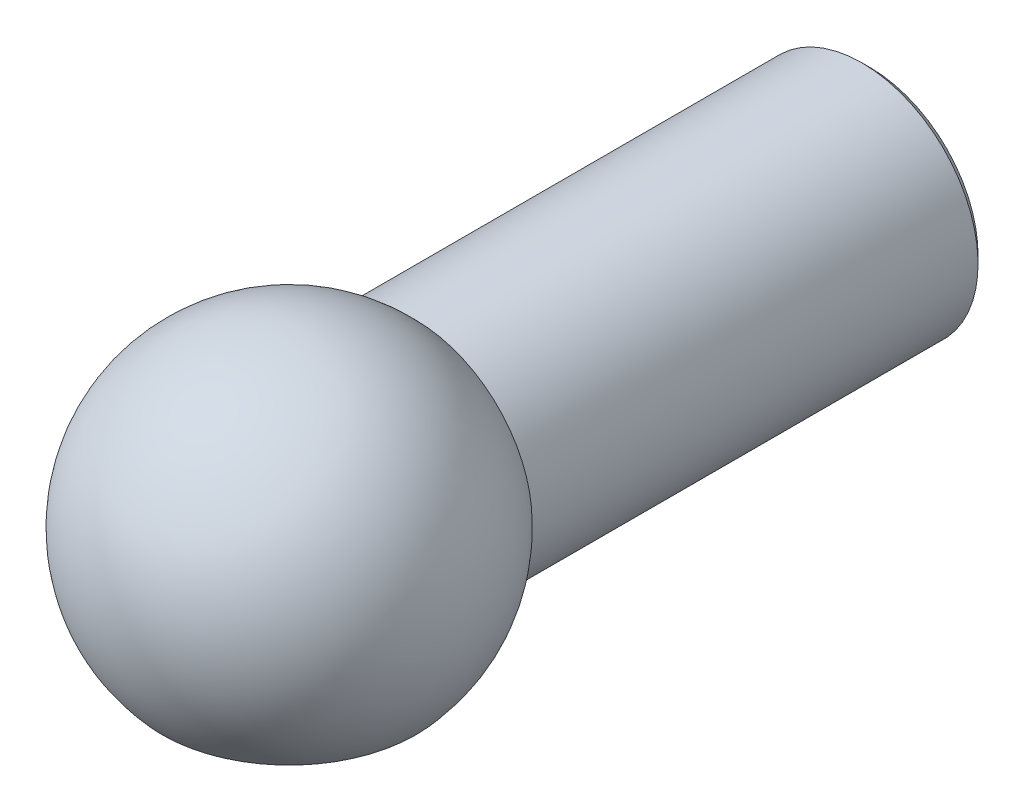
ISO-10303-21;
HEADER;
FILE_DESCRIPTION(('STEP AP214'),'2;1');
FILE_NAME('part.step','',(''),(''),'','','');
FILE_SCHEMA(('AUTOMOTIVE_DESIGN { 1 0 10303 214 1 1 1 1 }'));
ENDSEC;
DATA;
#1=APPLICATION_CONTEXT('core data for automotive mechanical design processes');
#2=APPLICATION_PROTOCOL_DEFINITION('international standard','automotive_design',2000,#1);
#3=PRODUCT_CONTEXT('',#1,'mechanical');
#4=PRODUCT('Part','Part','',(#3));
#5=PRODUCT_RELATED_PRODUCT_CATEGORY('part','',(#4));
#6=PRODUCT_DEFINITION_FORMATION('','',#4);
#7=PRODUCT_DEFINITION_CONTEXT('part definition',#1,'design');
#8=PRODUCT_DEFINITION('design','',#6,#7);
#9=PRODUCT_DEFINITION_SHAPE('','',#8);
#10=(LENGTH_UNIT() NAMED_UNIT(*) SI_UNIT(.MILLI.,.METRE.));
#11=(NAMED_UNIT(*) PLANE_ANGLE_UNIT() SI_UNIT($,.RADIAN.));
#12=(NAMED_UNIT(*) SI_UNIT($,.STERADIAN.) SOLID_ANGLE_UNIT());
#13=UNCERTAINTY_MEASURE_WITH_UNIT(LENGTH_MEASURE(1.E-05),#10,'distance_accuracy_value','');
#14=(GEOMETRIC_REPRESENTATION_CONTEXT(3) GLOBAL_UNCERTAINTY_ASSIGNED_CONTEXT((#13)) GLOBAL_UNIT_ASSIGNED_CONTEXT((#10,
#11,#12)) REPRESENTATION_CONTEXT('',''));
#15=CARTESIAN_POINT('',(0.,0.,0.));
#16=DIRECTION('',(0.,0.,1.));
#17=DIRECTION('',(1.,0.,0.));
#18=AXIS2_PLACEMENT_3D('',#15,#16,#17);
#19=CARTESIAN_POINT('',(0.,0.,-25.));
#20=DIRECTION('',(0.,0.,-1.));
#21=DIRECTION('',(-1.,0.,0.));
#22=AXIS2_PLACEMENT_3D('',#19,#20,#21);
#23=PLANE('',#22);
#24=CARTESIAN_POINT('',(0.,0.,-25.));
#25=DIRECTION('',(0.,0.,-1.));
#26=DIRECTION('',(1.,0.,0.));
#27=AXIS2_PLACEMENT_3D('',#24,#25,#26);
#28=CIRCLE('',#27,4.6464466094067);
#29=CARTESIAN_POINT('',(0.,4.6464466094067,-25.));
#30=VERTEX_POINT('',#29);
#31=EDGE_CURVE('E11',#30,#30,#28,.T.);
#32=ORIENTED_EDGE('',*,*,#31,.T.);
#33=EDGE_LOOP('',(#32));
#34=FACE_BOUND('',#33,.T.);
#35=CARTESIAN_POINT('',(0.,0.,-25.));
#36=DIRECTION('',(0.,0.,1.));
#37=DIRECTION('',(0.,1.,0.));
#38=AXIS2_PLACEMENT_3D('',#35,#36,#37);
#39=CIRCLE('',#38,3.);
#40=CARTESIAN_POINT('',(0.,3.,-25.));
#41=VERTEX_POINT('',#40);
#42=EDGE_CURVE('E94',#41,#41,#39,.T.);
#43=ORIENTED_EDGE('',*,*,#42,.T.);
#44=EDGE_LOOP('',(#43));
#45=FACE_BOUND('',#44,.T.);
#46=ADVANCED_FACE('F16',(#34,#45),#23,.T.);
#47=CARTESIAN_POINT('',(0.,0.,-24.8232233047035));
#48=DIRECTION('',(0.,0.,1.));
#49=DIRECTION('',(0.,1.,0.));
#50=AXIS2_PLACEMENT_3D('',#47,#48,#49);
#51=CONICAL_SURFACE('',#50,4.82322330470335,0.785398163397875);
#52=CARTESIAN_POINT('',(0.,0.,-24.646446609407));
#53=DIRECTION('',(0.,0.,-1.));
#54=DIRECTION('',(1.,0.,0.));
#55=AXIS2_PLACEMENT_3D('',#52,#53,#54);
#56=CIRCLE('',#55,5.);
#57=CARTESIAN_POINT('',(0.,5.,-24.646446609407));
#58=VERTEX_POINT('',#57);
#59=EDGE_CURVE('E27',#58,#58,#56,.T.);
#60=ORIENTED_EDGE('',*,*,#59,.T.);
#61=EDGE_LOOP('',(#60));
#62=FACE_BOUND('',#61,.T.);
#63=ORIENTED_EDGE('',*,*,#31,.F.);
#64=EDGE_LOOP('',(#63));
#65=FACE_BOUND('',#64,.T.);
#66=ADVANCED_FACE('F124',(#62,#65),#51,.T.);
#67=CARTESIAN_POINT('',(0.,0.,-15.0508596441007));
#68=DIRECTION('',(0.,0.,1.));
#69=DIRECTION('',(0.,1.,0.));
#70=AXIS2_PLACEMENT_3D('',#67,#68,#69);
#71=CYLINDRICAL_SURFACE('',#70,5.);
#72=CARTESIAN_POINT('',(0.,0.,-5.4552726787943));
#73=DIRECTION('',(0.,0.,-1.));
#74=DIRECTION('',(1.,0.,0.));
#75=AXIS2_PLACEMENT_3D('',#72,#73,#74);
#76=CIRCLE('',#75,5.);
#77=CARTESIAN_POINT('',(0.,-5.,-5.4552726787943));
#78=VERTEX_POINT('',#77);
#79=EDGE_CURVE('E85',#78,#78,#76,.T.);
#80=ORIENTED_EDGE('',*,*,#79,.T.);
#81=EDGE_LOOP('',(#80));
#82=FACE_BOUND('',#81,.T.);
#83=ORIENTED_EDGE('',*,*,#59,.F.);
#84=EDGE_LOOP('',(#83));
#85=FACE_BOUND('',#84,.T.);
#86=ADVANCED_FACE('F130',(#82,#85),#71,.T.);
#87=CARTESIAN_POINT('',(0.,0.,0.));
#88=DIRECTION('',(0.,0.,1.));
#89=DIRECTION('',(1.,0.,0.));
#90=AXIS2_PLACEMENT_3D('',#87,#88,#89);
#91=SPHERICAL_SURFACE('',#90,7.4);
#92=ORIENTED_EDGE('',*,*,#79,.F.);
#93=CARTESIAN_POINT('',(0.,-5.,0.));
#94=DIRECTION('',(0.,1.,0.));
#95=DIRECTION('',(0.,0.,-1.));
#96=AXIS2_PLACEMENT_3D('',#93,#94,#95);
#97=CIRCLE('',#96,5.45527267879431);
#98=EDGE_CURVE('E20',#78,#78,#97,.T.);
#99=ORIENTED_EDGE('',*,*,#98,.T.);
#100=EDGE_LOOP('',(#92,#99));
#101=FACE_BOUND('',#100,.T.);
#102=ADVANCED_FACE('F134',(#101),#91,.T.);
#103=CARTESIAN_POINT('',(0.,-5.,0.972363660602851));
#104=DIRECTION('',(0.,1.,0.));
#105=DIRECTION('',(0.,0.,1.));
#106=AXIS2_PLACEMENT_3D('',#103,#104,#105);
#107=PLANE('',#106);
#108=ORIENTED_EDGE('',*,*,#98,.F.);
#109=EDGE_LOOP('',(#108));
#110=FACE_BOUND('',#109,.T.);
#111=CARTESIAN_POINT('',(0.,-5.,-4.55191440096314E-13));
#112=DIRECTION('',(0.,1.,0.));
#113=DIRECTION('',(0.,0.,1.));
#114=AXIS2_PLACEMENT_3D('',#111,#112,#113);
#115=CIRCLE('',#114,4.6);
#116=CARTESIAN_POINT('',(0.,-5.,-4.6));
#117=VERTEX_POINT('',#116);
#118=EDGE_CURVE('E78',#117,#117,#115,.T.);
#119=ORIENTED_EDGE('',*,*,#118,.T.);
#120=EDGE_LOOP('',(#119));
#121=FACE_BOUND('',#120,.T.);
#122=ADVANCED_FACE('F136',(#110,#121),#107,.F.);
#123=CARTESIAN_POINT('',(0.,3.,-13.5));
#124=DIRECTION('',(0.,0.,1.));
#125=DIRECTION('',(1.,0.,0.));
#126=AXIS2_PLACEMENT_3D('',#123,#124,#125);
#127=PLANE('',#126);
#128=CARTESIAN_POINT('',(0.,0.,-13.5));
#129=DIRECTION('',(0.,0.,-1.));
#130=DIRECTION('',(1.,0.,0.));
#131=AXIS2_PLACEMENT_3D('',#128,#129,#130);
#132=CIRCLE('',#131,3.);
#133=CARTESIAN_POINT('',(0.,3.,-13.5));
#134=VERTEX_POINT('',#133);
#135=EDGE_CURVE('E84',#134,#134,#132,.T.);
#136=ORIENTED_EDGE('',*,*,#135,.T.);
#137=EDGE_LOOP('',(#136));
#138=FACE_BOUND('',#137,.T.);
#139=ADVANCED_FACE('F102',(#138),#127,.F.);
#140=CARTESIAN_POINT('',(0.,0.,-24.72925));
#141=DIRECTION('',(0.,0.,-1.));
#142=DIRECTION('',(0.,1.,0.));
#143=AXIS2_PLACEMENT_3D('',#140,#141,#142);
#144=CONICAL_SURFACE('',#143,2.72925,0.785398163397449);
#145=CARTESIAN_POINT('',(0.,0.,-24.4585));
#146=DIRECTION('',(0.,0.,-1.));
#147=DIRECTION('',(1.,0.,0.));
#148=AXIS2_PLACEMENT_3D('',#145,#146,#147);
#149=CIRCLE('',#148,2.4585);
#150=CARTESIAN_POINT('',(0.,2.4585,-24.4585));
#151=VERTEX_POINT('',#150);
#152=EDGE_CURVE('E90',#151,#151,#149,.T.);
#153=ORIENTED_EDGE('',*,*,#152,.F.);
#154=EDGE_LOOP('',(#153));
#155=FACE_BOUND('',#154,.T.);
#156=ORIENTED_EDGE('',*,*,#42,.F.);
#157=EDGE_LOOP('',(#156));
#158=FACE_BOUND('',#157,.T.);
#159=ADVANCED_FACE('F113',(#155,#158),#144,.F.);
#160=CARTESIAN_POINT('',(0.,0.,-19.25));
#161=DIRECTION('',(0.,0.,1.));
#162=DIRECTION('',(0.,1.,0.));
#163=AXIS2_PLACEMENT_3D('',#160,#161,#162);
#164=CYLINDRICAL_SURFACE('',#163,2.4585);
#165=CARTESIAN_POINT('',(0.,0.,-14.0415));
#166=DIRECTION('',(0.,0.,-1.));
#167=DIRECTION('',(1.,0.,0.));
#168=AXIS2_PLACEMENT_3D('',#165,#166,#167);
#169=CIRCLE('',#168,2.4585);
#170=CARTESIAN_POINT('',(0.,2.4585,-14.0415));
#171=VERTEX_POINT('',#170);
#172=EDGE_CURVE('E81',#171,#171,#169,.T.);
#173=ORIENTED_EDGE('',*,*,#172,.F.);
#174=EDGE_LOOP('',(#173));
#175=FACE_BOUND('',#174,.T.);
#176=ORIENTED_EDGE('',*,*,#152,.T.);
#177=EDGE_LOOP('',(#176));
#178=FACE_BOUND('',#177,.T.);
#179=ADVANCED_FACE('F107',(#175,#178),#164,.F.);
#180=CARTESIAN_POINT('',(0.,0.,-13.77075));
#181=DIRECTION('',(0.,0.,1.));
#182=DIRECTION('',(0.,1.,0.));
#183=AXIS2_PLACEMENT_3D('',#180,#181,#182);
#184=CONICAL_SURFACE('',#183,2.72925,0.785398163397449);
#185=ORIENTED_EDGE('',*,*,#135,.F.);
#186=EDGE_LOOP('',(#185));
#187=FACE_BOUND('',#186,.T.);
#188=ORIENTED_EDGE('',*,*,#172,.T.);
#189=EDGE_LOOP('',(#188));
#190=FACE_BOUND('',#189,.T.);
#191=ADVANCED_FACE('F104',(#187,#190),#184,.F.);
#192=CARTESIAN_POINT('',(0.,0.700000000000012,0.));
#193=DIRECTION('',(1.,0.,0.));
#194=DIRECTION('',(0.,-1.,0.));
#195=AXIS2_PLACEMENT_3D('',#192,#193,#194);
#196=SPHERICAL_SURFACE('',#195,5.);
#197=CARTESIAN_POINT('',(0.,0.700000000000012,0.));
#198=DIRECTION('',(0.,-1.,0.));
#199=DIRECTION('',(1.,0.,0.));
#200=AXIS2_PLACEMENT_3D('',#197,#198,#199);
#201=SPHERICAL_SURFACE('',#200,5.);
#202=CARTESIAN_POINT('',(0.,-1.2595917942265,0.));
#203=DIRECTION('',(0.,-1.,0.));
#204=DIRECTION('',(1.,0.,0.));
#205=AXIS2_PLACEMENT_3D('',#202,#203,#204);
#206=CIRCLE('',#205,4.6);
#207=CARTESIAN_POINT('',(0.,-1.2595917942265,-4.6));
#208=VERTEX_POINT('',#207);
#209=EDGE_CURVE('E64',#208,#208,#206,.T.);
#210=ORIENTED_EDGE('',*,*,#209,.T.);
#211=EDGE_LOOP('',(#210));
#212=FACE_BOUND('',#211,.T.);
#213=ADVANCED_FACE('F18',(#212),#201,.F.);
#214=CARTESIAN_POINT('',(0.,-3.5,-4.55191440096314E-13));
#215=DIRECTION('',(1.,0.,0.));
#216=DIRECTION('',(0.,-1.,0.));
#217=AXIS2_PLACEMENT_3D('',#214,#215,#216);
#218=SPHERICAL_SURFACE('',#217,4.8383881613612);
#219=CARTESIAN_POINT('',(0.,-3.5,-4.55191440096314E-13));
#220=DIRECTION('',(0.,-1.,0.));
#221=DIRECTION('',(1.,0.,0.));
#222=AXIS2_PLACEMENT_3D('',#219,#220,#221);
#223=SPHERICAL_SURFACE('',#222,4.8383881613612);
#224=CARTESIAN_POINT('',(0.,-2.,0.));
#225=DIRECTION('',(0.,-1.,0.));
#226=DIRECTION('',(1.,0.,0.));
#227=AXIS2_PLACEMENT_3D('',#224,#225,#226);
#228=CIRCLE('',#227,4.6);
#229=CARTESIAN_POINT('',(0.,-2.,-4.6));
#230=VERTEX_POINT('',#229);
#231=EDGE_CURVE('E69',#230,#230,#228,.T.);
#232=ORIENTED_EDGE('',*,*,#231,.F.);
#233=EDGE_LOOP('',(#232));
#234=FACE_BOUND('',#233,.T.);
#235=ORIENTED_EDGE('',*,*,#118,.F.);
#236=EDGE_LOOP('',(#235));
#237=FACE_BOUND('',#236,.T.);
#238=ADVANCED_FACE('F191',(#234,#237),#223,.F.);
#239=CARTESIAN_POINT('',(0.,-1.62979589711325,0.));
#240=DIRECTION('',(0.,1.,0.));
#241=DIRECTION('',(0.,0.,-1.));
#242=AXIS2_PLACEMENT_3D('',#239,#240,#241);
#243=CYLINDRICAL_SURFACE('',#242,4.6);
#244=ORIENTED_EDGE('',*,*,#209,.F.);
#245=EDGE_LOOP('',(#244));
#246=FACE_BOUND('',#245,.T.);
#247=ORIENTED_EDGE('',*,*,#231,.T.);
#248=EDGE_LOOP('',(#247));
#249=FACE_BOUND('',#248,.T.);
#250=ADVANCED_FACE('F70',(#246,#249),#243,.F.);
#251=CLOSED_SHELL('',(#46,#66,#86,#102,#122,#139,#159,#179,#191,#213,#238,#250));
#252=MANIFOLD_SOLID_BREP('B1',#251);
#253=ADVANCED_BREP_SHAPE_REPRESENTATION('',(#18,#252),#14);
#254=SHAPE_DEFINITION_REPRESENTATION(#9,#253);
ENDSEC;
END-ISO-10303-21;
